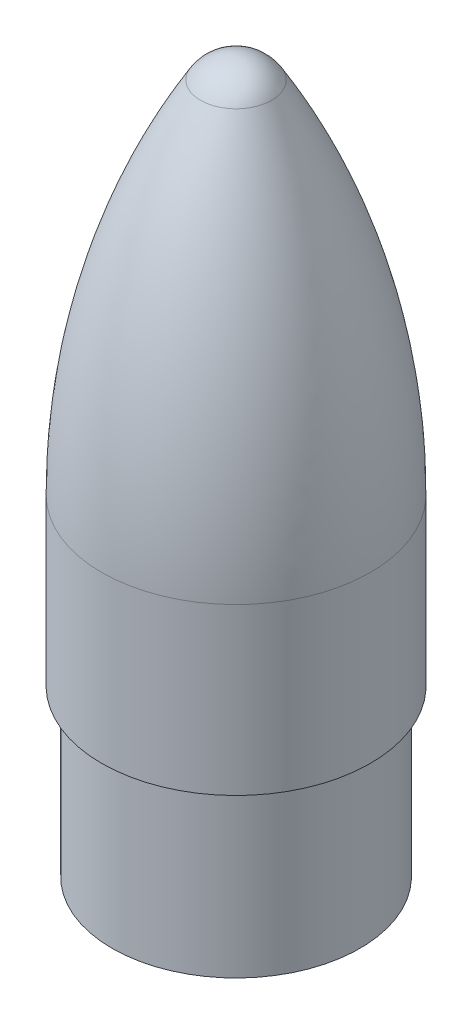
ISO-10303-21;
HEADER;
FILE_DESCRIPTION(('STEP AP214'),'2;1');
FILE_NAME('part.step','',(''),(''),'','','');
FILE_SCHEMA(('AUTOMOTIVE_DESIGN { 1 0 10303 214 1 1 1 1 }'));
ENDSEC;
DATA;
#1=APPLICATION_CONTEXT('core data for automotive mechanical design processes');
#2=APPLICATION_PROTOCOL_DEFINITION('international standard','automotive_design',2000,#1);
#3=PRODUCT_CONTEXT('',#1,'mechanical');
#4=PRODUCT('Part','Part','',(#3));
#5=PRODUCT_RELATED_PRODUCT_CATEGORY('part','',(#4));
#6=PRODUCT_DEFINITION_FORMATION('','',#4);
#7=PRODUCT_DEFINITION_CONTEXT('part definition',#1,'design');
#8=PRODUCT_DEFINITION('design','',#6,#7);
#9=PRODUCT_DEFINITION_SHAPE('','',#8);
#10=(LENGTH_UNIT() NAMED_UNIT(*) SI_UNIT(.MILLI.,.METRE.));
#11=(NAMED_UNIT(*) PLANE_ANGLE_UNIT() SI_UNIT($,.RADIAN.));
#12=(NAMED_UNIT(*) SI_UNIT($,.STERADIAN.) SOLID_ANGLE_UNIT());
#13=UNCERTAINTY_MEASURE_WITH_UNIT(LENGTH_MEASURE(1.E-05),#10,'distance_accuracy_value','');
#14=(GEOMETRIC_REPRESENTATION_CONTEXT(3) GLOBAL_UNCERTAINTY_ASSIGNED_CONTEXT((#13)) GLOBAL_UNIT_ASSIGNED_CONTEXT((#10,
#11,#12)) REPRESENTATION_CONTEXT('',''));
#15=CARTESIAN_POINT('',(0.,0.,0.));
#16=DIRECTION('',(0.,0.,1.));
#17=DIRECTION('',(1.,0.,0.));
#18=AXIS2_PLACEMENT_3D('',#15,#16,#17);
#19=CARTESIAN_POINT('',(0.,50.8,0.));
#20=DIRECTION('',(0.,-1.,0.));
#21=DIRECTION('',(0.,0.,-1.));
#22=AXIS2_PLACEMENT_3D('',#19,#20,#21);
#23=CYLINDRICAL_SURFACE('',#22,38.1);
#24=CARTESIAN_POINT('',(0.,50.8,0.));
#25=DIRECTION('',(0.,1.,0.));
#26=DIRECTION('',(0.,0.,1.));
#27=AXIS2_PLACEMENT_3D('',#24,#25,#26);
#28=CIRCLE('',#27,38.1);
#29=CARTESIAN_POINT('',(0.,50.8,38.1));
#30=VERTEX_POINT('',#29);
#31=EDGE_CURVE('E11',#30,#30,#28,.T.);
#32=ORIENTED_EDGE('',*,*,#31,.F.);
#33=EDGE_LOOP('',(#32));
#34=FACE_BOUND('',#33,.T.);
#35=CARTESIAN_POINT('',(0.,0.,0.));
#36=DIRECTION('',(0.,1.,0.));
#37=DIRECTION('',(0.,0.,1.));
#38=AXIS2_PLACEMENT_3D('',#35,#36,#37);
#39=CIRCLE('',#38,38.1);
#40=CARTESIAN_POINT('',(0.,0.,38.1));
#41=VERTEX_POINT('',#40);
#42=EDGE_CURVE('E46',#41,#41,#39,.T.);
#43=ORIENTED_EDGE('',*,*,#42,.T.);
#44=EDGE_LOOP('',(#43));
#45=FACE_BOUND('',#44,.T.);
#46=ADVANCED_FACE('F43',(#34,#45),#23,.T.);
#47=CARTESIAN_POINT('',(0.,0.,0.));
#48=DIRECTION('',(0.,1.,0.));
#49=DIRECTION('',(0.,0.,1.));
#50=AXIS2_PLACEMENT_3D('',#47,#48,#49);
#51=PLANE('',#50);
#52=ORIENTED_EDGE('',*,*,#42,.F.);
#53=EDGE_LOOP('',(#52));
#54=FACE_BOUND('',#53,.T.);
#55=ADVANCED_FACE('F110',(#54),#51,.F.);
#56=CARTESIAN_POINT('',(0.,101.6,0.));
#57=DIRECTION('',(0.,-1.,0.));
#58=DIRECTION('',(0.,0.,-1.));
#59=AXIS2_PLACEMENT_3D('',#56,#57,#58);
#60=CYLINDRICAL_SURFACE('',#59,41.275);
#61=CARTESIAN_POINT('',(0.,101.6,0.));
#62=DIRECTION('',(0.,1.,0.));
#63=DIRECTION('',(0.,0.,1.));
#64=AXIS2_PLACEMENT_3D('',#61,#62,#63);
#65=CIRCLE('',#64,41.275);
#66=CARTESIAN_POINT('',(0.,101.6,41.275));
#67=VERTEX_POINT('',#66);
#68=EDGE_CURVE('E56',#67,#67,#65,.T.);
#69=ORIENTED_EDGE('',*,*,#68,.F.);
#70=EDGE_LOOP('',(#69));
#71=FACE_BOUND('',#70,.T.);
#72=CARTESIAN_POINT('',(0.,50.8,0.));
#73=DIRECTION('',(0.,1.,0.));
#74=DIRECTION('',(0.,0.,1.));
#75=AXIS2_PLACEMENT_3D('',#72,#73,#74);
#76=CIRCLE('',#75,41.275);
#77=CARTESIAN_POINT('',(0.,50.8,41.275));
#78=VERTEX_POINT('',#77);
#79=EDGE_CURVE('E58',#78,#78,#76,.T.);
#80=ORIENTED_EDGE('',*,*,#79,.T.);
#81=EDGE_LOOP('',(#80));
#82=FACE_BOUND('',#81,.T.);
#83=ADVANCED_FACE('F108',(#71,#82),#60,.T.);
#84=CARTESIAN_POINT('',(0.,50.8,0.));
#85=DIRECTION('',(0.,1.,0.));
#86=DIRECTION('',(0.,0.,1.));
#87=AXIS2_PLACEMENT_3D('',#84,#85,#86);
#88=PLANE('',#87);
#89=ORIENTED_EDGE('',*,*,#31,.T.);
#90=EDGE_LOOP('',(#89));
#91=FACE_BOUND('',#90,.T.);
#92=ORIENTED_EDGE('',*,*,#79,.F.);
#93=EDGE_LOOP('',(#92));
#94=FACE_BOUND('',#93,.T.);
#95=ADVANCED_FACE('F100',(#91,#94),#88,.F.);
#96=CARTESIAN_POINT('',(-10.9151445847992,212.03135024712,0.));
#97=CARTESIAN_POINT('',(-10.999621726638,211.889323349992,0.));
#98=CARTESIAN_POINT('',(-11.1686798659127,211.60415409985,0.));
#99=CARTESIAN_POINT('',(-11.5264738080187,210.998380474508,0.));
#100=CARTESIAN_POINT('',(-11.9204117699816,210.324783550724,0.));
#101=CARTESIAN_POINT('',(-12.3111154330368,209.650979412703,0.));
#102=CARTESIAN_POINT('',(-12.7071590134003,208.962552915786,0.));
#103=CARTESIAN_POINT('',(-13.195659080111,208.10598394617,0.));
#104=CARTESIAN_POINT('',(-13.7817005819937,207.066687495738,0.));
#105=CARTESIAN_POINT('',(-14.6573716036437,205.491195217307,0.));
#106=CARTESIAN_POINT('',(-16.1932262791799,202.662272388108,0.));
#107=CARTESIAN_POINT('',(-18.4288369544118,198.367582763959,0.));
#108=CARTESIAN_POINT('',(-22.4871291941182,190.020959360258,0.));
#109=CARTESIAN_POINT('',(-28.3081204897933,176.263796505402,0.));
#110=CARTESIAN_POINT('',(-33.4912834096121,160.5236970696,0.));
#111=CARTESIAN_POINT('',(-36.9676649602742,145.570323281379,0.));
#112=CARTESIAN_POINT('',(-38.80915636874,134.422061302958,0.));
#113=CARTESIAN_POINT('',(-39.5628021475551,128.824148418213,0.));
#114=CARTESIAN_POINT('',(-39.9456178745487,125.619277994313,0.));
#115=CARTESIAN_POINT('',(-40.2386477926022,122.810299788052,0.));
#116=CARTESIAN_POINT('',(-40.4598168284456,120.399743968217,0.));
#117=CARTESIAN_POINT('',(-40.6241047448866,118.389166095866,0.));
#118=CARTESIAN_POINT('',(-40.7435159865786,116.779892998342,0.));
#119=CARTESIAN_POINT('',(-40.8509014232545,115.169512918571,0.));
#120=CARTESIAN_POINT('',(-40.9462550637703,113.558844583796,0.));
#121=CARTESIAN_POINT('',(-41.0295715878694,111.946697141541,0.));
#122=CARTESIAN_POINT('',(-41.1008463473947,110.33537398708,0.));
#123=CARTESIAN_POINT('',(-41.1597573112123,108.729726346853,0.));
#124=CARTESIAN_POINT('',(-41.2007345506572,107.334179725631,0.));
#125=CARTESIAN_POINT('',(-41.2283478659063,106.135820012481,0.));
#126=CARTESIAN_POINT('',(-41.2463831171971,105.16388333522,0.));
#127=CARTESIAN_POINT('',(-41.2579259092904,104.319246857316,0.));
#128=CARTESIAN_POINT('',(-41.2687474455777,103.512092247503,0.));
#129=CARTESIAN_POINT('',(-41.2735571028287,102.405649639554,0.));
#130=CARTESIAN_POINT('',(-41.2750000000188,101.930502854643,0.));
#131=CARTESIAN_POINT('',(-41.275,101.599999987702,0.));
#132=B_SPLINE_CURVE_WITH_KNOTS('',4,(#96,#97,#98,#99,#100,#101,#102,#103,#104,#105,#106,#107,
#108,#109,#110,#111,#112,#113,#114,#115,#116,#117,#118,#119,#120,#121,#122,#123,#124,#125,#126,
#127,#128,#129,#130,#131),.UNSPECIFIED.,.F.,.F.,(5,1,1,1,1,1,1,1,1,1,1,1,1,1,1,1,1,1,1,1,1,1,1,
1,1,1,1,1,1,1,1,1,5),(0.0830176102376253,0.088720151588018,0.0944226929384107,0.100125234288803,
0.105827775639196,0.111530316989589,0.117232858339982,0.128637941040767,0.140293379223051,
0.16360425558762,0.210226009886016,0.268503198797034,0.40836845723664,0.5948554643982,
0.688098976660116,0.711409859710879,0.734720742761643,0.758031606899762,0.781342471037881,
0.792997913207966,0.80465335537805,0.816308797548135,0.827964239718219,0.839619680352684,
0.851275120987148,0.862930561621613,0.874586002256078,0.885991086892895,0.891693629211304,
0.897396171529713,0.903098713848121,0.90880125616653,0.920206340697748),.UNSPECIFIED.);
#133=CARTESIAN_POINT('',(0.,0.,0.));
#134=DIRECTION('',(0.,-1.,0.));
#135=AXIS1_PLACEMENT('',#133,#134);
#136=SURFACE_OF_REVOLUTION('',#132,#135);
#137=ORIENTED_EDGE('',*,*,#68,.T.);
#138=EDGE_LOOP('',(#137));
#139=FACE_BOUND('',#138,.T.);
#140=CARTESIAN_POINT('',(0.,212.03135024712,0.));
#141=DIRECTION('',(0.,-1.,0.));
#142=DIRECTION('',(0.,0.,-1.));
#143=AXIS2_PLACEMENT_3D('',#140,#141,#142);
#144=CIRCLE('',#143,10.915144584799);
#145=CARTESIAN_POINT('',(0.,212.03135024712,-10.915144584799));
#146=VERTEX_POINT('',#145);
#147=EDGE_CURVE('E73',#146,#146,#144,.T.);
#148=ORIENTED_EDGE('',*,*,#147,.T.);
#149=EDGE_LOOP('',(#148));
#150=FACE_BOUND('',#149,.T.);
#151=ADVANCED_FACE('F96',(#139,#150),#136,.T.);
#152=CARTESIAN_POINT('',(0.,205.539043526425,0.));
#153=DIRECTION('',(0.,-1.,0.));
#154=DIRECTION('',(-1.,0.,0.));
#155=AXIS2_PLACEMENT_3D('',#152,#153,#154);
#156=SPHERICAL_SURFACE('',#155,12.7000168449751);
#157=ORIENTED_EDGE('',*,*,#147,.F.);
#158=EDGE_LOOP('',(#157));
#159=FACE_BOUND('',#158,.T.);
#160=ADVANCED_FACE('F99',(#159),#156,.T.);
#161=CLOSED_SHELL('',(#46,#55,#83,#95,#151,#160));
#162=CARTESIAN_POINT('',(0.,101.6,0.));
#163=DIRECTION('',(0.,1.,0.));
#164=DIRECTION('',(0.,0.,1.));
#165=AXIS2_PLACEMENT_3D('',#162,#163,#164);
#166=PLANE('',#165);
#167=CARTESIAN_POINT('',(0.,101.6,0.));
#168=DIRECTION('',(0.,-1.,0.));
#169=DIRECTION('',(0.,0.,-1.));
#170=AXIS2_PLACEMENT_3D('',#167,#168,#169);
#171=CIRCLE('',#170,37.465);
#172=CARTESIAN_POINT('',(0.,101.6,-37.465));
#173=VERTEX_POINT('',#172);
#174=EDGE_CURVE('E62',#173,#173,#171,.T.);
#175=ORIENTED_EDGE('',*,*,#174,.F.);
#176=EDGE_LOOP('',(#175));
#177=FACE_BOUND('',#176,.T.);
#178=ADVANCED_FACE('F102',(#177),#166,.T.);
#179=CARTESIAN_POINT('',(0.,204.379121566784,0.));
#180=DIRECTION('',(0.,-1.,0.));
#181=DIRECTION('',(-1.,0.,0.));
#182=AXIS2_PLACEMENT_3D('',#179,#180,#181);
#183=SPHERICAL_SURFACE('',#182,10.0499388046156);
#184=CARTESIAN_POINT('',(0.,210.27567461669,0.));
#185=DIRECTION('',(0.,-1.,0.));
#186=DIRECTION('',(0.,0.,-1.));
#187=AXIS2_PLACEMENT_3D('',#184,#185,#186);
#188=CIRCLE('',#187,8.13830032047012);
#189=CARTESIAN_POINT('',(0.,210.27567461669,-8.13830032047012));
#190=VERTEX_POINT('',#189);
#191=EDGE_CURVE('E69',#190,#190,#188,.T.);
#192=ORIENTED_EDGE('',*,*,#191,.T.);
#193=EDGE_LOOP('',(#192));
#194=FACE_BOUND('',#193,.T.);
#195=ADVANCED_FACE('F92',(#194),#183,.F.);
#196=CARTESIAN_POINT('',(-37.465,101.6,0.));
#197=CARTESIAN_POINT('',(-37.465,101.93050286694,0.));
#198=CARTESIAN_POINT('',(-37.463557102783,102.405649651852,0.));
#199=CARTESIAN_POINT('',(-37.4587474454693,103.5120922598,0.));
#200=CARTESIAN_POINT('',(-37.4479259091362,104.319246869612,0.));
#201=CARTESIAN_POINT('',(-37.4363831169944,105.163883347517,0.));
#202=CARTESIAN_POINT('',(-37.4183478656483,106.135820024776,0.));
#203=CARTESIAN_POINT('',(-37.3907345503311,107.334179737925,0.));
#204=CARTESIAN_POINT('',(-37.3497573108072,108.729726359144,0.));
#205=CARTESIAN_POINT('',(-37.2908463468975,110.335373999367,0.));
#206=CARTESIAN_POINT('',(-37.2195715872802,111.946697153824,0.));
#207=CARTESIAN_POINT('',(-37.1362550630904,113.558844596074,0.));
#208=CARTESIAN_POINT('',(-37.0409014224825,115.169512930844,0.));
#209=CARTESIAN_POINT('',(-36.9335159857148,116.77989301061,0.));
#210=CARTESIAN_POINT('',(-36.8141047439313,118.389166108126,0.));
#211=CARTESIAN_POINT('',(-36.649816827376,120.399743980469,0.));
#212=CARTESIAN_POINT('',(-36.428647791396,122.810299800291,0.));
#213=CARTESIAN_POINT('',(-36.135617873182,125.619278006535,0.));
#214=CARTESIAN_POINT('',(-35.7528021460059,128.824148430413,0.));
#215=CARTESIAN_POINT('',(-34.9991563668727,134.422061315115,0.));
#216=CARTESIAN_POINT('',(-33.1576649577725,145.570323293431,0.));
#217=CARTESIAN_POINT('',(-29.6812834062596,160.523697081455,0.));
#218=CARTESIAN_POINT('',(-24.498120485545,176.263796516962,0.));
#219=CARTESIAN_POINT('',(-18.6771291890874,190.020959371485,0.));
#220=CARTESIAN_POINT('',(-14.6188369489067,198.367582774957,0.));
#221=CARTESIAN_POINT('',(-12.3832262734299,202.662272398979,0.));
#222=CARTESIAN_POINT('',(-10.8473715977329,205.491195228091,0.));
#223=CARTESIAN_POINT('',(-9.97170057599273,207.066687506471,0.));
#224=CARTESIAN_POINT('',(-9.38565907405137,208.105983956871,0.));
#225=CARTESIAN_POINT('',(-8.8971590072916,208.962552926458,0.));
#226=CARTESIAN_POINT('',(-8.55784960361736,209.552360704424,0.));
#227=CARTESIAN_POINT('',(-8.32017223048673,209.962884371898,0.));
#228=CARTESIAN_POINT('',(-8.18029378133354,210.203522784658,0.));
#229=CARTESIAN_POINT('',(-8.13830032047012,210.27567461669,0.));
#230=B_SPLINE_CURVE_WITH_KNOTS('',4,(#196,#197,#198,#199,#200,#201,#202,#203,#204,#205,#206,
#207,#208,#209,#210,#211,#212,#213,#214,#215,#216,#217,#218,#219,#220,#221,#222,#223,#224,#225,
#226,#227,#228,#229),.UNSPECIFIED.,.F.,.F.,(5,1,1,1,1,1,1,1,1,1,1,1,1,1,1,1,1,1,1,1,1,1,1,1,1,1,
1,1,1,1,5),(0.0830176101436558,0.0944226947688435,0.100125237087252,0.105827779405661,
0.11153032172407,0.117232864042478,0.128637948679296,0.14029338931376,0.151948829948225,
0.16360427058269,0.175259711217155,0.186915153387239,0.198570595557323,0.210226037727408,
0.221881479897492,0.245192344035611,0.268503208173731,0.291814091224494,0.315124974275258,
0.408368486537173,0.594855493698733,0.73472075213834,0.792997941049358,0.839619695347753,
0.862930571712322,0.874586009894607,0.885991092595392,0.891693633945785,0.897396175296177,
0.90309871664657,0.905533648018852),.UNSPECIFIED.);
#231=CARTESIAN_POINT('',(0.,0.,0.));
#232=DIRECTION('',(0.,-1.,0.));
#233=AXIS1_PLACEMENT('',#231,#232);
#234=SURFACE_OF_REVOLUTION('',#230,#233);
#235=ORIENTED_EDGE('',*,*,#191,.F.);
#236=EDGE_LOOP('',(#235));
#237=FACE_BOUND('',#236,.T.);
#238=ORIENTED_EDGE('',*,*,#174,.T.);
#239=EDGE_LOOP('',(#238));
#240=FACE_BOUND('',#239,.T.);
#241=ADVANCED_FACE('F88',(#237,#240),#234,.T.);
#242=CLOSED_SHELL('',(#178,#195,#241));
#243=ORIENTED_CLOSED_SHELL('',*,#242,.T.);
#244=BREP_WITH_VOIDS('B2',#161,(#243));
#245=ADVANCED_BREP_SHAPE_REPRESENTATION('',(#18,#244),#14);
#246=SHAPE_DEFINITION_REPRESENTATION(#9,#245);
ENDSEC;
END-ISO-10303-21;
